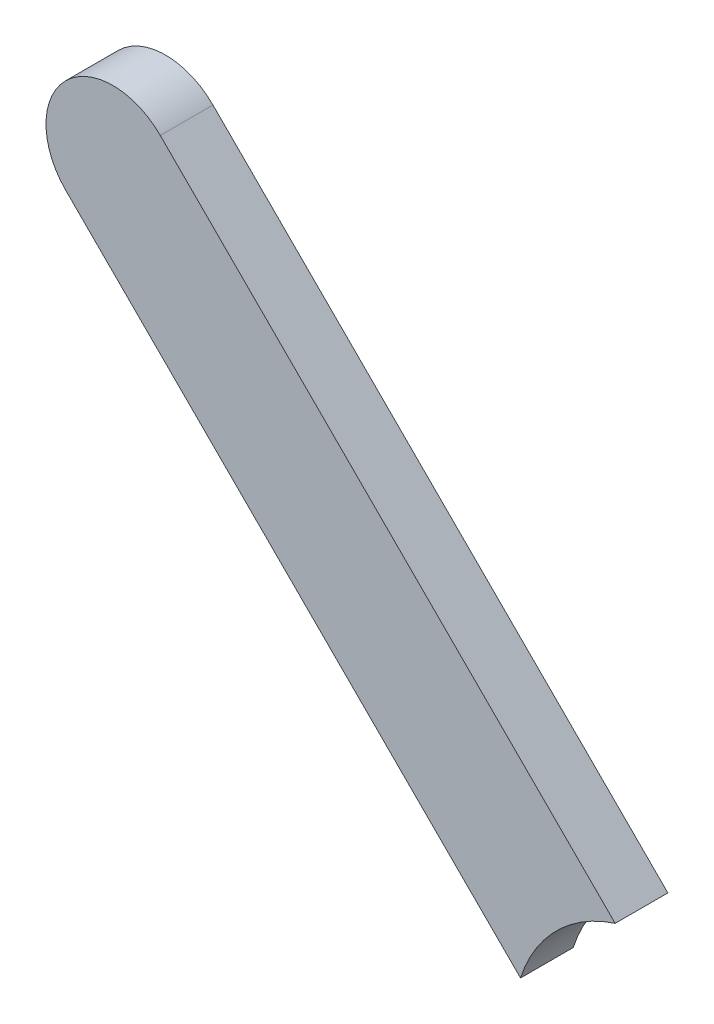
ISO-10303-21;
HEADER;
FILE_DESCRIPTION(('STEP AP214'),'2;1');
FILE_NAME('part.step','',(''),(''),'','','');
FILE_SCHEMA(('AUTOMOTIVE_DESIGN { 1 0 10303 214 1 1 1 1 }'));
ENDSEC;
DATA;
#1=APPLICATION_CONTEXT('core data for automotive mechanical design processes');
#2=APPLICATION_PROTOCOL_DEFINITION('international standard','automotive_design',2000,#1);
#3=PRODUCT_CONTEXT('',#1,'mechanical');
#4=PRODUCT('Part','Part','',(#3));
#5=PRODUCT_RELATED_PRODUCT_CATEGORY('part','',(#4));
#6=PRODUCT_DEFINITION_FORMATION('','',#4);
#7=PRODUCT_DEFINITION_CONTEXT('part definition',#1,'design');
#8=PRODUCT_DEFINITION('design','',#6,#7);
#9=PRODUCT_DEFINITION_SHAPE('','',#8);
#10=(LENGTH_UNIT() NAMED_UNIT(*) SI_UNIT(.MILLI.,.METRE.));
#11=(NAMED_UNIT(*) PLANE_ANGLE_UNIT() SI_UNIT($,.RADIAN.));
#12=(NAMED_UNIT(*) SI_UNIT($,.STERADIAN.) SOLID_ANGLE_UNIT());
#13=UNCERTAINTY_MEASURE_WITH_UNIT(LENGTH_MEASURE(1.E-05),#10,'distance_accuracy_value','');
#14=(GEOMETRIC_REPRESENTATION_CONTEXT(3) GLOBAL_UNCERTAINTY_ASSIGNED_CONTEXT((#13)) GLOBAL_UNIT_ASSIGNED_CONTEXT((#10,
#11,#12)) REPRESENTATION_CONTEXT('',''));
#15=CARTESIAN_POINT('',(0.,0.,0.));
#16=DIRECTION('',(0.,0.,1.));
#17=DIRECTION('',(1.,0.,0.));
#18=AXIS2_PLACEMENT_3D('',#15,#16,#17);
#19=CARTESIAN_POINT('',(111.52959406,108.19492966,0.));
#20=DIRECTION('',(0.707106781186545,0.70710678118655,0.));
#21=DIRECTION('',(0.70710678118655,-0.707106781186545,0.));
#22=AXIS2_PLACEMENT_3D('',#19,#20,#21);
#23=PLANE('',#22);
#24=DIRECTION('',(0.70710678118655,-0.707106781186545,0.));
#25=VECTOR('',#24,1.);
#26=CARTESIAN_POINT('',(111.52959406,108.19492966,0.1999996));
#27=LINE('',#26,#25);
#28=CARTESIAN_POINT('',(111.52959406,108.19492966,0.1999996));
#29=VERTEX_POINT('',#28);
#30=CARTESIAN_POINT('',(113.256196578856,106.468327141144,0.1999996));
#31=VERTEX_POINT('',#30);
#32=EDGE_CURVE('E11',#29,#31,#27,.T.);
#33=ORIENTED_EDGE('',*,*,#32,.F.);
#34=DIRECTION('',(0.,0.,1.));
#35=VECTOR('',#34,1.);
#36=CARTESIAN_POINT('',(111.52959406,108.19492966,0.));
#37=LINE('',#36,#35);
#38=CARTESIAN_POINT('',(111.52959406,108.19492966,0.));
#39=VERTEX_POINT('',#38);
#40=EDGE_CURVE('E24',#39,#29,#37,.T.);
#41=ORIENTED_EDGE('',*,*,#40,.F.);
#42=DIRECTION('',(0.70710678118655,-0.707106781186545,0.));
#43=VECTOR('',#42,1.);
#44=CARTESIAN_POINT('',(111.52959406,108.19492966,0.));
#45=LINE('',#44,#43);
#46=CARTESIAN_POINT('',(113.256196578856,106.468327141144,0.));
#47=VERTEX_POINT('',#46);
#48=EDGE_CURVE('E75',#39,#47,#45,.T.);
#49=ORIENTED_EDGE('',*,*,#48,.T.);
#50=DIRECTION('',(0.,0.,1.));
#51=VECTOR('',#50,1.);
#52=CARTESIAN_POINT('',(113.256196578856,106.468327141144,0.));
#53=LINE('',#52,#51);
#54=EDGE_CURVE('E37',#47,#31,#53,.T.);
#55=ORIENTED_EDGE('',*,*,#54,.T.);
#56=EDGE_LOOP('',(#33,#41,#49,#55));
#57=FACE_BOUND('',#56,.T.);
#58=ADVANCED_FACE('F17',(#57),#23,.F.);
#59=CARTESIAN_POINT('',(113.7847356,106.299,0.));
#60=DIRECTION('',(0.,0.,-1.));
#61=DIRECTION('',(1.,0.,0.));
#62=AXIS2_PLACEMENT_3D('',#59,#60,#61);
#63=CYLINDRICAL_SURFACE('',#62,0.55500016);
#64=DIRECTION('',(0.,0.,1.));
#65=VECTOR('',#64,1.);
#66=CARTESIAN_POINT('',(113.615408458856,106.827539021144,0.));
#67=LINE('',#66,#65);
#68=CARTESIAN_POINT('',(113.615408458856,106.827539021144,0.));
#69=VERTEX_POINT('',#68);
#70=CARTESIAN_POINT('',(113.615408458856,106.827539021144,0.1999996));
#71=VERTEX_POINT('',#70);
#72=EDGE_CURVE('E67',#69,#71,#67,.T.);
#73=ORIENTED_EDGE('',*,*,#72,.T.);
#74=CARTESIAN_POINT('',(113.7847356,106.299,0.1999996));
#75=DIRECTION('',(0.,0.,1.));
#76=DIRECTION('',(1.,0.,0.));
#77=AXIS2_PLACEMENT_3D('',#74,#75,#76);
#78=CIRCLE('',#77,0.55500016);
#79=EDGE_CURVE('E82',#71,#31,#78,.T.);
#80=ORIENTED_EDGE('',*,*,#79,.T.);
#81=ORIENTED_EDGE('',*,*,#54,.F.);
#82=CARTESIAN_POINT('',(113.7847356,106.299,0.));
#83=DIRECTION('',(0.,0.,1.));
#84=DIRECTION('',(1.,0.,0.));
#85=AXIS2_PLACEMENT_3D('',#82,#83,#84);
#86=CIRCLE('',#85,0.55500016);
#87=EDGE_CURVE('E80',#69,#47,#86,.T.);
#88=ORIENTED_EDGE('',*,*,#87,.F.);
#89=EDGE_LOOP('',(#73,#80,#81,#88));
#90=FACE_BOUND('',#89,.T.);
#91=ADVANCED_FACE('F88',(#90),#63,.F.);
#92=CARTESIAN_POINT('',(113.615408458856,106.827539021144,0.));
#93=DIRECTION('',(-0.707106781186548,-0.707106781186548,0.));
#94=DIRECTION('',(-0.707106781186548,0.707106781186548,0.));
#95=AXIS2_PLACEMENT_3D('',#92,#93,#94);
#96=PLANE('',#95);
#97=DIRECTION('',(-0.707106781186548,0.707106781186548,0.));
#98=VECTOR('',#97,1.);
#99=CARTESIAN_POINT('',(113.96434154,106.47860594,0.1999996));
#100=LINE('',#99,#98);
#101=CARTESIAN_POINT('',(111.88880594,108.55414154,0.1999996));
#102=VERTEX_POINT('',#101);
#103=EDGE_CURVE('E71',#71,#102,#100,.T.);
#104=ORIENTED_EDGE('',*,*,#103,.F.);
#105=ORIENTED_EDGE('',*,*,#72,.F.);
#106=DIRECTION('',(-0.707106781186548,0.707106781186548,0.));
#107=VECTOR('',#106,1.);
#108=CARTESIAN_POINT('',(113.96434154,106.47860594,0.));
#109=LINE('',#108,#107);
#110=CARTESIAN_POINT('',(111.88880594,108.55414154,0.));
#111=VERTEX_POINT('',#110);
#112=EDGE_CURVE('E63',#69,#111,#109,.T.);
#113=ORIENTED_EDGE('',*,*,#112,.T.);
#114=DIRECTION('',(0.,0.,1.));
#115=VECTOR('',#114,1.);
#116=CARTESIAN_POINT('',(111.88880594,108.55414154,0.));
#117=LINE('',#116,#115);
#118=EDGE_CURVE('E53',#111,#102,#117,.T.);
#119=ORIENTED_EDGE('',*,*,#118,.T.);
#120=EDGE_LOOP('',(#104,#105,#113,#119));
#121=FACE_BOUND('',#120,.T.);
#122=ADVANCED_FACE('F66',(#121),#96,.F.);
#123=CARTESIAN_POINT('',(111.7092,108.3745356,0.));
#124=DIRECTION('',(0.,0.,-1.));
#125=DIRECTION('',(0.707106781186576,0.70710678118652,0.));
#126=AXIS2_PLACEMENT_3D('',#123,#124,#125);
#127=CYLINDRICAL_SURFACE('',#126,0.254001156230774);
#128=CARTESIAN_POINT('',(111.7092,108.3745356,0.1999996));
#129=DIRECTION('',(0.,0.,1.));
#130=DIRECTION('',(0.707106781186576,0.70710678118652,0.));
#131=AXIS2_PLACEMENT_3D('',#128,#129,#130);
#132=CIRCLE('',#131,0.254001156230774);
#133=EDGE_CURVE('E59',#102,#29,#132,.T.);
#134=ORIENTED_EDGE('',*,*,#133,.F.);
#135=ORIENTED_EDGE('',*,*,#118,.F.);
#136=CARTESIAN_POINT('',(111.7092,108.3745356,0.));
#137=DIRECTION('',(0.,0.,1.));
#138=DIRECTION('',(0.707106781186576,0.70710678118652,0.));
#139=AXIS2_PLACEMENT_3D('',#136,#137,#138);
#140=CIRCLE('',#139,0.254001156230774);
#141=EDGE_CURVE('E57',#111,#39,#140,.T.);
#142=ORIENTED_EDGE('',*,*,#141,.T.);
#143=ORIENTED_EDGE('',*,*,#40,.T.);
#144=EDGE_LOOP('',(#134,#135,#142,#143));
#145=FACE_BOUND('',#144,.T.);
#146=ADVANCED_FACE('F55',(#145),#127,.T.);
#147=CARTESIAN_POINT('',(111.52959406,108.19492966,0.));
#148=DIRECTION('',(0.,0.,-1.));
#149=DIRECTION('',(-1.,0.,0.));
#150=AXIS2_PLACEMENT_3D('',#147,#148,#149);
#151=PLANE('',#150);
#152=ORIENTED_EDGE('',*,*,#48,.F.);
#153=ORIENTED_EDGE('',*,*,#141,.F.);
#154=ORIENTED_EDGE('',*,*,#112,.F.);
#155=ORIENTED_EDGE('',*,*,#87,.T.);
#156=EDGE_LOOP('',(#152,#153,#154,#155));
#157=FACE_BOUND('',#156,.T.);
#158=ADVANCED_FACE('F74',(#157),#151,.T.);
#159=CARTESIAN_POINT('',(111.52959406,108.19492966,0.1999996));
#160=DIRECTION('',(0.,0.,-1.));
#161=DIRECTION('',(-1.,0.,0.));
#162=AXIS2_PLACEMENT_3D('',#159,#160,#161);
#163=PLANE('',#162);
#164=ORIENTED_EDGE('',*,*,#133,.T.);
#165=ORIENTED_EDGE('',*,*,#32,.T.);
#166=ORIENTED_EDGE('',*,*,#79,.F.);
#167=ORIENTED_EDGE('',*,*,#103,.T.);
#168=EDGE_LOOP('',(#164,#165,#166,#167));
#169=FACE_BOUND('',#168,.T.);
#170=ADVANCED_FACE('F91',(#169),#163,.F.);
#171=CLOSED_SHELL('',(#58,#91,#122,#146,#158,#170));
#172=MANIFOLD_SOLID_BREP('B1',#171);
#173=ADVANCED_BREP_SHAPE_REPRESENTATION('',(#18,#172),#14);
#174=SHAPE_DEFINITION_REPRESENTATION(#9,#173);
ENDSEC;
END-ISO-10303-21;
